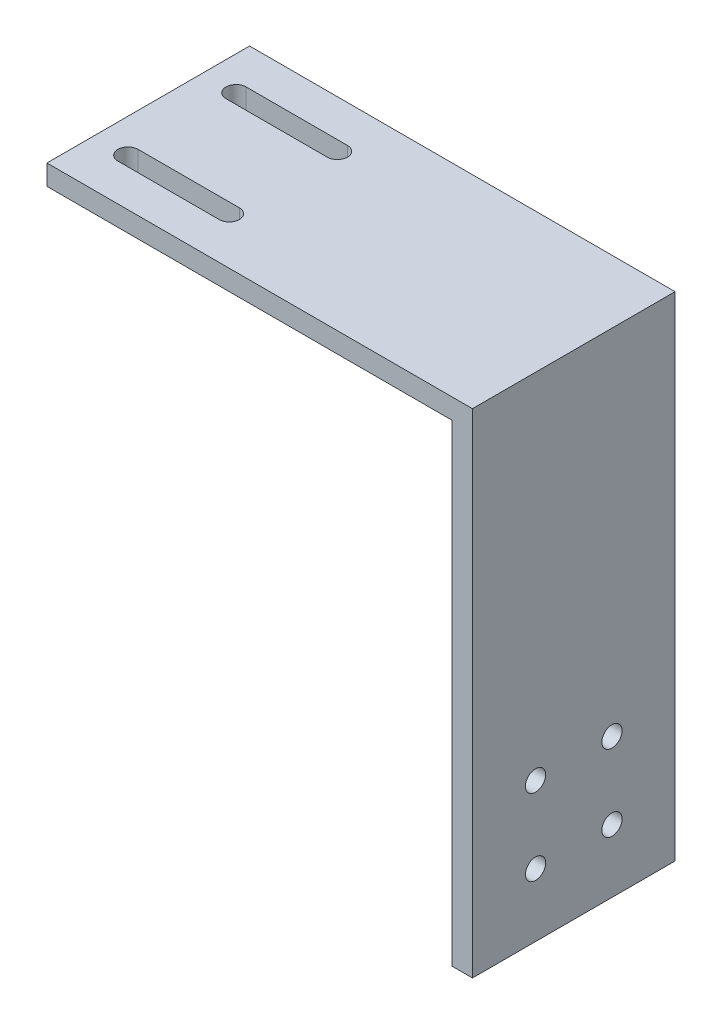
ISO-10303-21;
HEADER;
FILE_DESCRIPTION(('STEP AP214'),'2;1');
FILE_NAME('part.step','',(''),(''),'','','');
FILE_SCHEMA(('AUTOMOTIVE_DESIGN { 1 0 10303 214 1 1 1 1 }'));
ENDSEC;
DATA;
#1=APPLICATION_CONTEXT('core data for automotive mechanical design processes');
#2=APPLICATION_PROTOCOL_DEFINITION('international standard','automotive_design',2000,#1);
#3=PRODUCT_CONTEXT('',#1,'mechanical');
#4=PRODUCT('Part','Part','',(#3));
#5=PRODUCT_RELATED_PRODUCT_CATEGORY('part','',(#4));
#6=PRODUCT_DEFINITION_FORMATION('','',#4);
#7=PRODUCT_DEFINITION_CONTEXT('part definition',#1,'design');
#8=PRODUCT_DEFINITION('design','',#6,#7);
#9=PRODUCT_DEFINITION_SHAPE('','',#8);
#10=(LENGTH_UNIT() NAMED_UNIT(*) SI_UNIT(.MILLI.,.METRE.));
#11=(NAMED_UNIT(*) PLANE_ANGLE_UNIT() SI_UNIT($,.RADIAN.));
#12=(NAMED_UNIT(*) SI_UNIT($,.STERADIAN.) SOLID_ANGLE_UNIT());
#13=UNCERTAINTY_MEASURE_WITH_UNIT(LENGTH_MEASURE(1.E-05),#10,'distance_accuracy_value','');
#14=(GEOMETRIC_REPRESENTATION_CONTEXT(3) GLOBAL_UNCERTAINTY_ASSIGNED_CONTEXT((#13)) GLOBAL_UNIT_ASSIGNED_CONTEXT((#10,
#11,#12)) REPRESENTATION_CONTEXT('',''));
#15=CARTESIAN_POINT('',(0.,0.,0.));
#16=DIRECTION('',(0.,0.,1.));
#17=DIRECTION('',(1.,0.,0.));
#18=AXIS2_PLACEMENT_3D('',#15,#16,#17);
#19=CARTESIAN_POINT('',(-1.92857142857143,65.1357142857143,30.));
#20=DIRECTION('',(0.,-1.,0.));
#21=DIRECTION('',(1.,0.,0.));
#22=AXIS2_PLACEMENT_3D('',#19,#20,#21);
#23=PLANE('',#22);
#24=DIRECTION('',(1.,0.,0.));
#25=VECTOR('',#24,1.);
#26=CARTESIAN_POINT('',(-59.9285714285714,65.1357142857143,8.5));
#27=LINE('',#26,#25);
#28=CARTESIAN_POINT('',(-59.9285714285714,65.1357142857143,8.5));
#29=VERTEX_POINT('',#28);
#30=CARTESIAN_POINT('',(-44.9285714285714,65.1357142857143,8.5));
#31=VERTEX_POINT('',#30);
#32=EDGE_CURVE('E166',#29,#31,#27,.T.);
#33=ORIENTED_EDGE('',*,*,#32,.F.);
#34=CARTESIAN_POINT('',(-59.9285714285714,65.1357142857143,7.));
#35=DIRECTION('',(0.,1.,0.));
#36=DIRECTION('',(1.,0.,0.));
#37=AXIS2_PLACEMENT_3D('',#34,#35,#36);
#38=CIRCLE('',#37,1.5);
#39=CARTESIAN_POINT('',(-59.9285714285714,65.1357142857143,5.5));
#40=VERTEX_POINT('',#39);
#41=EDGE_CURVE('E47',#40,#29,#38,.T.);
#42=ORIENTED_EDGE('',*,*,#41,.F.);
#43=DIRECTION('',(-1.,0.,0.));
#44=VECTOR('',#43,1.);
#45=CARTESIAN_POINT('',(-59.9285714285714,65.1357142857143,5.5));
#46=LINE('',#45,#44);
#47=CARTESIAN_POINT('',(-44.9285714285714,65.1357142857143,5.5));
#48=VERTEX_POINT('',#47);
#49=EDGE_CURVE('E154',#48,#40,#46,.T.);
#50=ORIENTED_EDGE('',*,*,#49,.F.);
#51=CARTESIAN_POINT('',(-44.9285714285714,65.1357142857143,7.));
#52=DIRECTION('',(0.,1.,0.));
#53=DIRECTION('',(-1.,0.,0.));
#54=AXIS2_PLACEMENT_3D('',#51,#52,#53);
#55=CIRCLE('',#54,1.5);
#56=EDGE_CURVE('E157',#31,#48,#55,.T.);
#57=ORIENTED_EDGE('',*,*,#56,.F.);
#58=EDGE_LOOP('',(#33,#42,#50,#57));
#59=FACE_BOUND('',#58,.T.);
#60=DIRECTION('',(1.,0.,0.));
#61=VECTOR('',#60,1.);
#62=CARTESIAN_POINT('',(-59.9285714285714,65.1357142857143,24.5));
#63=LINE('',#62,#61);
#64=CARTESIAN_POINT('',(-59.9285714285714,65.1357142857143,24.5));
#65=VERTEX_POINT('',#64);
#66=CARTESIAN_POINT('',(-44.9285714285714,65.1357142857143,24.5));
#67=VERTEX_POINT('',#66);
#68=EDGE_CURVE('E192',#65,#67,#63,.T.);
#69=ORIENTED_EDGE('',*,*,#68,.F.);
#70=CARTESIAN_POINT('',(-59.9285714285714,65.1357142857143,23.));
#71=DIRECTION('',(0.,1.,0.));
#72=DIRECTION('',(-1.,0.,0.));
#73=AXIS2_PLACEMENT_3D('',#70,#71,#72);
#74=CIRCLE('',#73,1.5);
#75=CARTESIAN_POINT('',(-59.9285714285714,65.1357142857143,21.5));
#76=VERTEX_POINT('',#75);
#77=EDGE_CURVE('E55',#76,#65,#74,.T.);
#78=ORIENTED_EDGE('',*,*,#77,.F.);
#79=DIRECTION('',(-1.,0.,0.));
#80=VECTOR('',#79,1.);
#81=CARTESIAN_POINT('',(-59.9285714285714,65.1357142857143,21.5));
#82=LINE('',#81,#80);
#83=CARTESIAN_POINT('',(-44.9285714285714,65.1357142857143,21.5));
#84=VERTEX_POINT('',#83);
#85=EDGE_CURVE('E181',#84,#76,#82,.T.);
#86=ORIENTED_EDGE('',*,*,#85,.F.);
#87=CARTESIAN_POINT('',(-44.9285714285714,65.1357142857143,23.));
#88=DIRECTION('',(0.,1.,0.));
#89=DIRECTION('',(1.,0.,0.));
#90=AXIS2_PLACEMENT_3D('',#87,#88,#89);
#91=CIRCLE('',#90,1.5);
#92=EDGE_CURVE('E196',#67,#84,#91,.T.);
#93=ORIENTED_EDGE('',*,*,#92,.F.);
#94=EDGE_LOOP('',(#69,#78,#86,#93));
#95=FACE_BOUND('',#94,.T.);
#96=DIRECTION('',(-1.,0.,0.));
#97=VECTOR('',#96,1.);
#98=CARTESIAN_POINT('',(-1.92857142857143,65.1357142857143,0.));
#99=LINE('',#98,#97);
#100=CARTESIAN_POINT('',(-1.92857142857143,65.1357142857143,0.));
#101=VERTEX_POINT('',#100);
#102=CARTESIAN_POINT('',(-64.9285714285714,65.1357142857143,0.));
#103=VERTEX_POINT('',#102);
#104=EDGE_CURVE('E173',#101,#103,#99,.T.);
#105=ORIENTED_EDGE('',*,*,#104,.T.);
#106=DIRECTION('',(0.,0.,-1.));
#107=VECTOR('',#106,1.);
#108=CARTESIAN_POINT('',(-64.9285714285714,65.1357142857143,30.));
#109=LINE('',#108,#107);
#110=CARTESIAN_POINT('',(-64.9285714285714,65.1357142857143,30.));
#111=VERTEX_POINT('',#110);
#112=EDGE_CURVE('E11',#111,#103,#109,.T.);
#113=ORIENTED_EDGE('',*,*,#112,.F.);
#114=DIRECTION('',(-1.,0.,0.));
#115=VECTOR('',#114,1.);
#116=CARTESIAN_POINT('',(-1.92857142857143,65.1357142857143,30.));
#117=LINE('',#116,#115);
#118=CARTESIAN_POINT('',(-1.92857142857143,65.1357142857143,30.));
#119=VERTEX_POINT('',#118);
#120=EDGE_CURVE('E207',#119,#111,#117,.T.);
#121=ORIENTED_EDGE('',*,*,#120,.F.);
#122=DIRECTION('',(0.,0.,-1.));
#123=VECTOR('',#122,1.);
#124=CARTESIAN_POINT('',(-1.92857142857143,65.1357142857143,30.));
#125=LINE('',#124,#123);
#126=EDGE_CURVE('E221',#119,#101,#125,.T.);
#127=ORIENTED_EDGE('',*,*,#126,.T.);
#128=EDGE_LOOP('',(#105,#113,#121,#127));
#129=FACE_BOUND('',#128,.T.);
#130=ADVANCED_FACE('F33',(#59,#95,#129),#23,.F.);
#131=CARTESIAN_POINT('',(-64.9285714285714,65.1357142857143,30.));
#132=DIRECTION('',(1.,0.,0.));
#133=DIRECTION('',(0.,0.,-1.));
#134=AXIS2_PLACEMENT_3D('',#131,#132,#133);
#135=PLANE('',#134);
#136=DIRECTION('',(0.,-1.,0.));
#137=VECTOR('',#136,1.);
#138=CARTESIAN_POINT('',(-64.9285714285714,65.1357142857143,0.));
#139=LINE('',#138,#137);
#140=CARTESIAN_POINT('',(-64.9285714285714,62.1357142857143,0.));
#141=VERTEX_POINT('',#140);
#142=EDGE_CURVE('E224',#103,#141,#139,.T.);
#143=ORIENTED_EDGE('',*,*,#142,.T.);
#144=DIRECTION('',(0.,0.,-1.));
#145=VECTOR('',#144,1.);
#146=CARTESIAN_POINT('',(-64.9285714285714,62.1357142857143,30.));
#147=LINE('',#146,#145);
#148=CARTESIAN_POINT('',(-64.9285714285714,62.1357142857143,30.));
#149=VERTEX_POINT('',#148);
#150=EDGE_CURVE('E40',#149,#141,#147,.T.);
#151=ORIENTED_EDGE('',*,*,#150,.F.);
#152=DIRECTION('',(0.,-1.,0.));
#153=VECTOR('',#152,1.);
#154=CARTESIAN_POINT('',(-64.9285714285714,65.1357142857143,30.));
#155=LINE('',#154,#153);
#156=EDGE_CURVE('E210',#111,#149,#155,.T.);
#157=ORIENTED_EDGE('',*,*,#156,.F.);
#158=ORIENTED_EDGE('',*,*,#112,.T.);
#159=EDGE_LOOP('',(#143,#151,#157,#158));
#160=FACE_BOUND('',#159,.T.);
#161=ADVANCED_FACE('F270',(#160),#135,.F.);
#162=CARTESIAN_POINT('',(-64.9285714285714,62.1357142857143,30.));
#163=DIRECTION('',(0.,1.,0.));
#164=DIRECTION('',(0.,0.,1.));
#165=AXIS2_PLACEMENT_3D('',#162,#163,#164);
#166=PLANE('',#165);
#167=DIRECTION('',(-1.,0.,0.));
#168=VECTOR('',#167,1.);
#169=CARTESIAN_POINT('',(-59.9285714285714,62.1357142857143,5.5));
#170=LINE('',#169,#168);
#171=CARTESIAN_POINT('',(-44.9285714285714,62.1357142857143,5.5));
#172=VERTEX_POINT('',#171);
#173=CARTESIAN_POINT('',(-59.9285714285714,62.1357142857143,5.5));
#174=VERTEX_POINT('',#173);
#175=EDGE_CURVE('E141',#172,#174,#170,.T.);
#176=ORIENTED_EDGE('',*,*,#175,.T.);
#177=CARTESIAN_POINT('',(-59.9285714285714,62.1357142857143,7.));
#178=DIRECTION('',(0.,1.,0.));
#179=DIRECTION('',(1.,0.,0.));
#180=AXIS2_PLACEMENT_3D('',#177,#178,#179);
#181=CIRCLE('',#180,1.5);
#182=CARTESIAN_POINT('',(-59.9285714285714,62.1357142857143,8.5));
#183=VERTEX_POINT('',#182);
#184=EDGE_CURVE('E135',#174,#183,#181,.T.);
#185=ORIENTED_EDGE('',*,*,#184,.T.);
#186=DIRECTION('',(1.,0.,0.));
#187=VECTOR('',#186,1.);
#188=CARTESIAN_POINT('',(-59.9285714285714,62.1357142857143,8.5));
#189=LINE('',#188,#187);
#190=CARTESIAN_POINT('',(-44.9285714285714,62.1357142857143,8.5));
#191=VERTEX_POINT('',#190);
#192=EDGE_CURVE('E145',#183,#191,#189,.T.);
#193=ORIENTED_EDGE('',*,*,#192,.T.);
#194=CARTESIAN_POINT('',(-44.9285714285714,62.1357142857143,7.));
#195=DIRECTION('',(0.,1.,0.));
#196=DIRECTION('',(-1.,0.,0.));
#197=AXIS2_PLACEMENT_3D('',#194,#195,#196);
#198=CIRCLE('',#197,1.5);
#199=EDGE_CURVE('E149',#191,#172,#198,.T.);
#200=ORIENTED_EDGE('',*,*,#199,.T.);
#201=EDGE_LOOP('',(#176,#185,#193,#200));
#202=FACE_BOUND('',#201,.T.);
#203=DIRECTION('',(-1.,0.,0.));
#204=VECTOR('',#203,1.);
#205=CARTESIAN_POINT('',(-59.9285714285714,62.1357142857143,21.5));
#206=LINE('',#205,#204);
#207=CARTESIAN_POINT('',(-44.9285714285714,62.1357142857143,21.5));
#208=VERTEX_POINT('',#207);
#209=CARTESIAN_POINT('',(-59.9285714285714,62.1357142857143,21.5));
#210=VERTEX_POINT('',#209);
#211=EDGE_CURVE('E187',#208,#210,#206,.T.);
#212=ORIENTED_EDGE('',*,*,#211,.T.);
#213=CARTESIAN_POINT('',(-59.9285714285714,62.1357142857143,23.));
#214=DIRECTION('',(0.,1.,0.));
#215=DIRECTION('',(-1.,0.,0.));
#216=AXIS2_PLACEMENT_3D('',#213,#214,#215);
#217=CIRCLE('',#216,1.5);
#218=CARTESIAN_POINT('',(-59.9285714285714,62.1357142857143,24.5));
#219=VERTEX_POINT('',#218);
#220=EDGE_CURVE('E177',#210,#219,#217,.T.);
#221=ORIENTED_EDGE('',*,*,#220,.T.);
#222=DIRECTION('',(1.,0.,0.));
#223=VECTOR('',#222,1.);
#224=CARTESIAN_POINT('',(-59.9285714285714,62.1357142857143,24.5));
#225=LINE('',#224,#223);
#226=CARTESIAN_POINT('',(-44.9285714285714,62.1357142857143,24.5));
#227=VERTEX_POINT('',#226);
#228=EDGE_CURVE('E180',#219,#227,#225,.T.);
#229=ORIENTED_EDGE('',*,*,#228,.T.);
#230=CARTESIAN_POINT('',(-44.9285714285714,62.1357142857143,23.));
#231=DIRECTION('',(0.,1.,0.));
#232=DIRECTION('',(1.,0.,0.));
#233=AXIS2_PLACEMENT_3D('',#230,#231,#232);
#234=CIRCLE('',#233,1.5);
#235=EDGE_CURVE('E184',#227,#208,#234,.T.);
#236=ORIENTED_EDGE('',*,*,#235,.T.);
#237=EDGE_LOOP('',(#212,#221,#229,#236));
#238=FACE_BOUND('',#237,.T.);
#239=DIRECTION('',(1.,0.,0.));
#240=VECTOR('',#239,1.);
#241=CARTESIAN_POINT('',(-64.9285714285714,62.1357142857143,0.));
#242=LINE('',#241,#240);
#243=CARTESIAN_POINT('',(-4.92857142857144,62.1357142857143,0.));
#244=VERTEX_POINT('',#243);
#245=EDGE_CURVE('E226',#141,#244,#242,.T.);
#246=ORIENTED_EDGE('',*,*,#245,.T.);
#247=DIRECTION('',(0.,0.,-1.));
#248=VECTOR('',#247,1.);
#249=CARTESIAN_POINT('',(-4.92857142857144,62.1357142857143,30.));
#250=LINE('',#249,#248);
#251=CARTESIAN_POINT('',(-4.92857142857144,62.1357142857143,30.));
#252=VERTEX_POINT('',#251);
#253=EDGE_CURVE('E241',#252,#244,#250,.T.);
#254=ORIENTED_EDGE('',*,*,#253,.F.);
#255=DIRECTION('',(1.,0.,0.));
#256=VECTOR('',#255,1.);
#257=CARTESIAN_POINT('',(-64.9285714285714,62.1357142857143,30.));
#258=LINE('',#257,#256);
#259=EDGE_CURVE('E213',#149,#252,#258,.T.);
#260=ORIENTED_EDGE('',*,*,#259,.F.);
#261=ORIENTED_EDGE('',*,*,#150,.T.);
#262=EDGE_LOOP('',(#246,#254,#260,#261));
#263=FACE_BOUND('',#262,.T.);
#264=ADVANCED_FACE('F151',(#202,#238,#263),#166,.F.);
#265=CARTESIAN_POINT('',(-4.92857142857144,62.1357142857143,30.));
#266=DIRECTION('',(1.,0.,0.));
#267=DIRECTION('',(0.,1.,0.));
#268=AXIS2_PLACEMENT_3D('',#265,#266,#267);
#269=PLANE('',#268);
#270=CARTESIAN_POINT('',(-4.92857142857143,12.7925685352066,20.6568542494924));
#271=DIRECTION('',(-1.,0.,0.));
#272=DIRECTION('',(0.,-1.,0.));
#273=AXIS2_PLACEMENT_3D('',#270,#271,#272);
#274=CIRCLE('',#273,1.5);
#275=CARTESIAN_POINT('',(-4.92857142857143,11.2925685352066,20.6568542494924));
#276=VERTEX_POINT('',#275);
#277=EDGE_CURVE('E443',#276,#276,#274,.T.);
#278=ORIENTED_EDGE('',*,*,#277,.F.);
#279=EDGE_LOOP('',(#278));
#280=FACE_BOUND('',#279,.T.);
#281=CARTESIAN_POINT('',(-4.92857142857143,12.7925685352067,9.34314575050766));
#282=DIRECTION('',(-1.,0.,0.));
#283=DIRECTION('',(0.,-1.,0.));
#284=AXIS2_PLACEMENT_3D('',#281,#282,#283);
#285=CIRCLE('',#284,1.5);
#286=CARTESIAN_POINT('',(-4.92857142857143,11.2925685352067,9.34314575050766));
#287=VERTEX_POINT('',#286);
#288=EDGE_CURVE('E445',#287,#287,#285,.T.);
#289=ORIENTED_EDGE('',*,*,#288,.F.);
#290=EDGE_LOOP('',(#289));
#291=FACE_BOUND('',#290,.T.);
#292=CARTESIAN_POINT('',(-4.92857142857143,1.47886003622193,9.3431457505076));
#293=DIRECTION('',(-1.,0.,0.));
#294=DIRECTION('',(0.,-1.,0.));
#295=AXIS2_PLACEMENT_3D('',#292,#293,#294);
#296=CIRCLE('',#295,1.5);
#297=CARTESIAN_POINT('',(-4.92857142857143,-0.0211399637780731,9.3431457505076));
#298=VERTEX_POINT('',#297);
#299=EDGE_CURVE('E456',#298,#298,#296,.T.);
#300=ORIENTED_EDGE('',*,*,#299,.F.);
#301=EDGE_LOOP('',(#300));
#302=FACE_BOUND('',#301,.T.);
#303=CARTESIAN_POINT('',(-4.92857142857143,1.47886003622191,20.6568542494924));
#304=DIRECTION('',(-1.,0.,0.));
#305=DIRECTION('',(0.,-1.,0.));
#306=AXIS2_PLACEMENT_3D('',#303,#304,#305);
#307=CIRCLE('',#306,1.5);
#308=CARTESIAN_POINT('',(-4.92857142857143,-0.0211399637780945,20.6568542494924));
#309=VERTEX_POINT('',#308);
#310=EDGE_CURVE('E160',#309,#309,#307,.T.);
#311=ORIENTED_EDGE('',*,*,#310,.F.);
#312=EDGE_LOOP('',(#311));
#313=FACE_BOUND('',#312,.T.);
#314=DIRECTION('',(0.,-1.,0.));
#315=VECTOR('',#314,1.);
#316=CARTESIAN_POINT('',(-4.92857142857144,62.1357142857143,0.));
#317=LINE('',#316,#315);
#318=CARTESIAN_POINT('',(-4.92857142857143,-7.86428571428571,0.));
#319=VERTEX_POINT('',#318);
#320=EDGE_CURVE('E228',#244,#319,#317,.T.);
#321=ORIENTED_EDGE('',*,*,#320,.T.);
#322=DIRECTION('',(0.,0.,-1.));
#323=VECTOR('',#322,1.);
#324=CARTESIAN_POINT('',(-4.92857142857143,-7.86428571428571,30.));
#325=LINE('',#324,#323);
#326=CARTESIAN_POINT('',(-4.92857142857143,-7.86428571428571,30.));
#327=VERTEX_POINT('',#326);
#328=EDGE_CURVE('E238',#327,#319,#325,.T.);
#329=ORIENTED_EDGE('',*,*,#328,.F.);
#330=DIRECTION('',(0.,-1.,0.));
#331=VECTOR('',#330,1.);
#332=CARTESIAN_POINT('',(-4.92857142857144,62.1357142857143,30.));
#333=LINE('',#332,#331);
#334=EDGE_CURVE('E215',#252,#327,#333,.T.);
#335=ORIENTED_EDGE('',*,*,#334,.F.);
#336=ORIENTED_EDGE('',*,*,#253,.T.);
#337=EDGE_LOOP('',(#321,#329,#335,#336));
#338=FACE_BOUND('',#337,.T.);
#339=ADVANCED_FACE('F258',(#280,#291,#302,#313,#338),#269,.F.);
#340=CARTESIAN_POINT('',(-4.92857142857143,-7.86428571428571,30.));
#341=DIRECTION('',(0.,1.,0.));
#342=DIRECTION('',(0.,0.,1.));
#343=AXIS2_PLACEMENT_3D('',#340,#341,#342);
#344=PLANE('',#343);
#345=DIRECTION('',(1.,0.,0.));
#346=VECTOR('',#345,1.);
#347=CARTESIAN_POINT('',(-4.92857142857143,-7.86428571428571,0.));
#348=LINE('',#347,#346);
#349=CARTESIAN_POINT('',(-1.92857142857143,-7.86428571428571,0.));
#350=VERTEX_POINT('',#349);
#351=EDGE_CURVE('E230',#319,#350,#348,.T.);
#352=ORIENTED_EDGE('',*,*,#351,.T.);
#353=DIRECTION('',(0.,0.,-1.));
#354=VECTOR('',#353,1.);
#355=CARTESIAN_POINT('',(-1.92857142857143,-7.86428571428571,30.));
#356=LINE('',#355,#354);
#357=CARTESIAN_POINT('',(-1.92857142857143,-7.86428571428571,30.));
#358=VERTEX_POINT('',#357);
#359=EDGE_CURVE('E235',#358,#350,#356,.T.);
#360=ORIENTED_EDGE('',*,*,#359,.F.);
#361=DIRECTION('',(1.,0.,0.));
#362=VECTOR('',#361,1.);
#363=CARTESIAN_POINT('',(-4.92857142857143,-7.86428571428571,30.));
#364=LINE('',#363,#362);
#365=EDGE_CURVE('E217',#327,#358,#364,.T.);
#366=ORIENTED_EDGE('',*,*,#365,.F.);
#367=ORIENTED_EDGE('',*,*,#328,.T.);
#368=EDGE_LOOP('',(#352,#360,#366,#367));
#369=FACE_BOUND('',#368,.T.);
#370=ADVANCED_FACE('F262',(#369),#344,.F.);
#371=CARTESIAN_POINT('',(-1.92857142857143,-7.86428571428571,30.));
#372=DIRECTION('',(-1.,0.,0.));
#373=DIRECTION('',(0.,-1.,0.));
#374=AXIS2_PLACEMENT_3D('',#371,#372,#373);
#375=PLANE('',#374);
#376=CARTESIAN_POINT('',(-1.92857142857142,12.7925685352066,20.6568542494924));
#377=DIRECTION('',(-1.,0.,0.));
#378=DIRECTION('',(0.,-1.,0.));
#379=AXIS2_PLACEMENT_3D('',#376,#377,#378);
#380=CIRCLE('',#379,1.5);
#381=CARTESIAN_POINT('',(-1.92857142857142,11.2925685352066,20.6568542494924));
#382=VERTEX_POINT('',#381);
#383=EDGE_CURVE('E440',#382,#382,#380,.T.);
#384=ORIENTED_EDGE('',*,*,#383,.T.);
#385=EDGE_LOOP('',(#384));
#386=FACE_BOUND('',#385,.T.);
#387=CARTESIAN_POINT('',(-1.92857142857142,12.7925685352067,9.34314575050766));
#388=DIRECTION('',(-1.,0.,0.));
#389=DIRECTION('',(0.,-1.,0.));
#390=AXIS2_PLACEMENT_3D('',#387,#388,#389);
#391=CIRCLE('',#390,1.5);
#392=CARTESIAN_POINT('',(-1.92857142857142,11.2925685352067,9.34314575050766));
#393=VERTEX_POINT('',#392);
#394=EDGE_CURVE('E461',#393,#393,#391,.T.);
#395=ORIENTED_EDGE('',*,*,#394,.T.);
#396=EDGE_LOOP('',(#395));
#397=FACE_BOUND('',#396,.T.);
#398=CARTESIAN_POINT('',(-1.92857142857142,1.47886003622193,9.3431457505076));
#399=DIRECTION('',(-1.,0.,0.));
#400=DIRECTION('',(0.,-1.,0.));
#401=AXIS2_PLACEMENT_3D('',#398,#399,#400);
#402=CIRCLE('',#401,1.5);
#403=CARTESIAN_POINT('',(-1.92857142857142,-0.0211399637780726,9.3431457505076));
#404=VERTEX_POINT('',#403);
#405=EDGE_CURVE('E452',#404,#404,#402,.T.);
#406=ORIENTED_EDGE('',*,*,#405,.T.);
#407=EDGE_LOOP('',(#406));
#408=FACE_BOUND('',#407,.T.);
#409=CARTESIAN_POINT('',(-1.92857142857142,1.47886003622191,20.6568542494924));
#410=DIRECTION('',(-1.,0.,0.));
#411=DIRECTION('',(0.,-1.,0.));
#412=AXIS2_PLACEMENT_3D('',#409,#410,#411);
#413=CIRCLE('',#412,1.5);
#414=CARTESIAN_POINT('',(-1.92857142857142,-0.0211399637780941,20.6568542494924));
#415=VERTEX_POINT('',#414);
#416=EDGE_CURVE('E193',#415,#415,#413,.T.);
#417=ORIENTED_EDGE('',*,*,#416,.T.);
#418=EDGE_LOOP('',(#417));
#419=FACE_BOUND('',#418,.T.);
#420=DIRECTION('',(0.,1.,0.));
#421=VECTOR('',#420,1.);
#422=CARTESIAN_POINT('',(-1.92857142857143,-7.86428571428571,0.));
#423=LINE('',#422,#421);
#424=EDGE_CURVE('E211',#350,#101,#423,.T.);
#425=ORIENTED_EDGE('',*,*,#424,.T.);
#426=ORIENTED_EDGE('',*,*,#126,.F.);
#427=DIRECTION('',(0.,1.,0.));
#428=VECTOR('',#427,1.);
#429=CARTESIAN_POINT('',(-1.92857142857143,-7.86428571428571,30.));
#430=LINE('',#429,#428);
#431=EDGE_CURVE('E219',#358,#119,#430,.T.);
#432=ORIENTED_EDGE('',*,*,#431,.F.);
#433=ORIENTED_EDGE('',*,*,#359,.T.);
#434=EDGE_LOOP('',(#425,#426,#432,#433));
#435=FACE_BOUND('',#434,.T.);
#436=ADVANCED_FACE('F273',(#386,#397,#408,#419,#435),#375,.F.);
#437=CARTESIAN_POINT('',(0.,0.,30.));
#438=DIRECTION('',(0.,0.,1.));
#439=DIRECTION('',(1.,0.,0.));
#440=AXIS2_PLACEMENT_3D('',#437,#438,#439);
#441=PLANE('',#440);
#442=ORIENTED_EDGE('',*,*,#120,.T.);
#443=ORIENTED_EDGE('',*,*,#156,.T.);
#444=ORIENTED_EDGE('',*,*,#259,.T.);
#445=ORIENTED_EDGE('',*,*,#334,.T.);
#446=ORIENTED_EDGE('',*,*,#365,.T.);
#447=ORIENTED_EDGE('',*,*,#431,.T.);
#448=EDGE_LOOP('',(#442,#443,#444,#445,#446,#447));
#449=FACE_BOUND('',#448,.T.);
#450=ADVANCED_FACE('F266',(#449),#441,.T.);
#451=CARTESIAN_POINT('',(0.,0.,0.));
#452=DIRECTION('',(0.,0.,1.));
#453=DIRECTION('',(1.,0.,0.));
#454=AXIS2_PLACEMENT_3D('',#451,#452,#453);
#455=PLANE('',#454);
#456=ORIENTED_EDGE('',*,*,#104,.F.);
#457=ORIENTED_EDGE('',*,*,#424,.F.);
#458=ORIENTED_EDGE('',*,*,#351,.F.);
#459=ORIENTED_EDGE('',*,*,#320,.F.);
#460=ORIENTED_EDGE('',*,*,#245,.F.);
#461=ORIENTED_EDGE('',*,*,#142,.F.);
#462=EDGE_LOOP('',(#456,#457,#458,#459,#460,#461));
#463=FACE_BOUND('',#462,.T.);
#464=ADVANCED_FACE('F253',(#463),#455,.F.);
#465=CARTESIAN_POINT('',(-59.9285714285714,62.1357142857143,23.));
#466=DIRECTION('',(0.,1.,0.));
#467=DIRECTION('',(-1.,0.,0.));
#468=AXIS2_PLACEMENT_3D('',#465,#466,#467);
#469=CYLINDRICAL_SURFACE('',#468,1.5);
#470=ORIENTED_EDGE('',*,*,#77,.T.);
#471=DIRECTION('',(0.,1.,0.));
#472=VECTOR('',#471,1.);
#473=CARTESIAN_POINT('',(-59.9285714285714,62.1357142857143,24.5));
#474=LINE('',#473,#472);
#475=EDGE_CURVE('E190',#219,#65,#474,.T.);
#476=ORIENTED_EDGE('',*,*,#475,.F.);
#477=ORIENTED_EDGE('',*,*,#220,.F.);
#478=DIRECTION('',(0.,1.,0.));
#479=VECTOR('',#478,1.);
#480=CARTESIAN_POINT('',(-59.9285714285714,62.1357142857143,21.5));
#481=LINE('',#480,#479);
#482=EDGE_CURVE('E167',#210,#76,#481,.T.);
#483=ORIENTED_EDGE('',*,*,#482,.T.);
#484=EDGE_LOOP('',(#470,#476,#477,#483));
#485=FACE_BOUND('',#484,.T.);
#486=ADVANCED_FACE('F301',(#485),#469,.F.);
#487=CARTESIAN_POINT('',(-59.9285714285714,62.1357142857143,21.5));
#488=DIRECTION('',(0.,0.,-1.));
#489=DIRECTION('',(-1.,0.,0.));
#490=AXIS2_PLACEMENT_3D('',#487,#488,#489);
#491=PLANE('',#490);
#492=ORIENTED_EDGE('',*,*,#85,.T.);
#493=ORIENTED_EDGE('',*,*,#482,.F.);
#494=ORIENTED_EDGE('',*,*,#211,.F.);
#495=DIRECTION('',(0.,1.,0.));
#496=VECTOR('',#495,1.);
#497=CARTESIAN_POINT('',(-44.9285714285714,62.1357142857143,21.5));
#498=LINE('',#497,#496);
#499=EDGE_CURVE('E202',#208,#84,#498,.T.);
#500=ORIENTED_EDGE('',*,*,#499,.T.);
#501=EDGE_LOOP('',(#492,#493,#494,#500));
#502=FACE_BOUND('',#501,.T.);
#503=ADVANCED_FACE('F304',(#502),#491,.F.);
#504=CARTESIAN_POINT('',(-44.9285714285714,62.1357142857143,23.));
#505=DIRECTION('',(0.,1.,0.));
#506=DIRECTION('',(-1.,0.,0.));
#507=AXIS2_PLACEMENT_3D('',#504,#505,#506);
#508=CYLINDRICAL_SURFACE('',#507,1.5);
#509=ORIENTED_EDGE('',*,*,#92,.T.);
#510=ORIENTED_EDGE('',*,*,#499,.F.);
#511=ORIENTED_EDGE('',*,*,#235,.F.);
#512=DIRECTION('',(0.,1.,0.));
#513=VECTOR('',#512,1.);
#514=CARTESIAN_POINT('',(-44.9285714285714,62.1357142857143,24.5));
#515=LINE('',#514,#513);
#516=EDGE_CURVE('E204',#227,#67,#515,.T.);
#517=ORIENTED_EDGE('',*,*,#516,.T.);
#518=EDGE_LOOP('',(#509,#510,#511,#517));
#519=FACE_BOUND('',#518,.T.);
#520=ADVANCED_FACE('F306',(#519),#508,.F.);
#521=CARTESIAN_POINT('',(-59.9285714285714,62.1357142857143,24.5));
#522=DIRECTION('',(0.,0.,1.));
#523=DIRECTION('',(1.,0.,0.));
#524=AXIS2_PLACEMENT_3D('',#521,#522,#523);
#525=PLANE('',#524);
#526=ORIENTED_EDGE('',*,*,#68,.T.);
#527=ORIENTED_EDGE('',*,*,#516,.F.);
#528=ORIENTED_EDGE('',*,*,#228,.F.);
#529=ORIENTED_EDGE('',*,*,#475,.T.);
#530=EDGE_LOOP('',(#526,#527,#528,#529));
#531=FACE_BOUND('',#530,.T.);
#532=ADVANCED_FACE('F298',(#531),#525,.F.);
#533=CARTESIAN_POINT('',(-59.9285714285714,62.1357142857143,7.));
#534=DIRECTION('',(0.,1.,0.));
#535=DIRECTION('',(-1.,0.,0.));
#536=AXIS2_PLACEMENT_3D('',#533,#534,#535);
#537=CYLINDRICAL_SURFACE('',#536,1.5);
#538=ORIENTED_EDGE('',*,*,#41,.T.);
#539=DIRECTION('',(0.,1.,0.));
#540=VECTOR('',#539,1.);
#541=CARTESIAN_POINT('',(-59.9285714285714,62.1357142857143,8.5));
#542=LINE('',#541,#540);
#543=EDGE_CURVE('E131',#183,#29,#542,.T.);
#544=ORIENTED_EDGE('',*,*,#543,.F.);
#545=ORIENTED_EDGE('',*,*,#184,.F.);
#546=DIRECTION('',(0.,1.,0.));
#547=VECTOR('',#546,1.);
#548=CARTESIAN_POINT('',(-59.9285714285714,62.1357142857143,5.5));
#549=LINE('',#548,#547);
#550=EDGE_CURVE('E171',#174,#40,#549,.T.);
#551=ORIENTED_EDGE('',*,*,#550,.T.);
#552=EDGE_LOOP('',(#538,#544,#545,#551));
#553=FACE_BOUND('',#552,.T.);
#554=ADVANCED_FACE('F133',(#553),#537,.F.);
#555=CARTESIAN_POINT('',(-59.9285714285714,62.1357142857143,5.5));
#556=DIRECTION('',(0.,0.,-1.));
#557=DIRECTION('',(-1.,0.,0.));
#558=AXIS2_PLACEMENT_3D('',#555,#556,#557);
#559=PLANE('',#558);
#560=ORIENTED_EDGE('',*,*,#49,.T.);
#561=ORIENTED_EDGE('',*,*,#550,.F.);
#562=ORIENTED_EDGE('',*,*,#175,.F.);
#563=DIRECTION('',(0.,1.,0.));
#564=VECTOR('',#563,1.);
#565=CARTESIAN_POINT('',(-44.9285714285714,62.1357142857143,5.5));
#566=LINE('',#565,#564);
#567=EDGE_CURVE('E174',#172,#48,#566,.T.);
#568=ORIENTED_EDGE('',*,*,#567,.T.);
#569=EDGE_LOOP('',(#560,#561,#562,#568));
#570=FACE_BOUND('',#569,.T.);
#571=ADVANCED_FACE('F351',(#570),#559,.F.);
#572=CARTESIAN_POINT('',(-44.9285714285714,62.1357142857143,7.));
#573=DIRECTION('',(0.,1.,0.));
#574=DIRECTION('',(-1.,0.,0.));
#575=AXIS2_PLACEMENT_3D('',#572,#573,#574);
#576=CYLINDRICAL_SURFACE('',#575,1.5);
#577=ORIENTED_EDGE('',*,*,#56,.T.);
#578=ORIENTED_EDGE('',*,*,#567,.F.);
#579=ORIENTED_EDGE('',*,*,#199,.F.);
#580=DIRECTION('',(0.,1.,0.));
#581=VECTOR('',#580,1.);
#582=CARTESIAN_POINT('',(-44.9285714285714,62.1357142857143,8.5));
#583=LINE('',#582,#581);
#584=EDGE_CURVE('E140',#191,#31,#583,.T.);
#585=ORIENTED_EDGE('',*,*,#584,.T.);
#586=EDGE_LOOP('',(#577,#578,#579,#585));
#587=FACE_BOUND('',#586,.T.);
#588=ADVANCED_FACE('F359',(#587),#576,.F.);
#589=CARTESIAN_POINT('',(-59.9285714285714,62.1357142857143,8.5));
#590=DIRECTION('',(0.,0.,1.));
#591=DIRECTION('',(1.,0.,0.));
#592=AXIS2_PLACEMENT_3D('',#589,#590,#591);
#593=PLANE('',#592);
#594=ORIENTED_EDGE('',*,*,#32,.T.);
#595=ORIENTED_EDGE('',*,*,#584,.F.);
#596=ORIENTED_EDGE('',*,*,#192,.F.);
#597=ORIENTED_EDGE('',*,*,#543,.T.);
#598=EDGE_LOOP('',(#594,#595,#596,#597));
#599=FACE_BOUND('',#598,.T.);
#600=ADVANCED_FACE('F146',(#599),#593,.F.);
#601=CARTESIAN_POINT('',(-1.92857142857142,1.47886003622191,20.6568542494924));
#602=DIRECTION('',(-1.,0.,0.));
#603=DIRECTION('',(0.,-1.,0.));
#604=AXIS2_PLACEMENT_3D('',#601,#602,#603);
#605=CYLINDRICAL_SURFACE('',#604,1.5);
#606=ORIENTED_EDGE('',*,*,#416,.F.);
#607=EDGE_LOOP('',(#606));
#608=FACE_BOUND('',#607,.T.);
#609=ORIENTED_EDGE('',*,*,#310,.T.);
#610=EDGE_LOOP('',(#609));
#611=FACE_BOUND('',#610,.T.);
#612=ADVANCED_FACE('F378',(#608,#611),#605,.F.);
#613=CARTESIAN_POINT('',(-1.92857142857142,1.47886003622193,9.3431457505076));
#614=DIRECTION('',(-1.,0.,0.));
#615=DIRECTION('',(0.,-1.,0.));
#616=AXIS2_PLACEMENT_3D('',#613,#614,#615);
#617=CYLINDRICAL_SURFACE('',#616,1.5);
#618=ORIENTED_EDGE('',*,*,#405,.F.);
#619=EDGE_LOOP('',(#618));
#620=FACE_BOUND('',#619,.T.);
#621=ORIENTED_EDGE('',*,*,#299,.T.);
#622=EDGE_LOOP('',(#621));
#623=FACE_BOUND('',#622,.T.);
#624=ADVANCED_FACE('F404',(#620,#623),#617,.F.);
#625=CARTESIAN_POINT('',(-1.92857142857142,12.7925685352067,9.34314575050766));
#626=DIRECTION('',(-1.,0.,0.));
#627=DIRECTION('',(0.,-1.,0.));
#628=AXIS2_PLACEMENT_3D('',#625,#626,#627);
#629=CYLINDRICAL_SURFACE('',#628,1.5);
#630=ORIENTED_EDGE('',*,*,#394,.F.);
#631=EDGE_LOOP('',(#630));
#632=FACE_BOUND('',#631,.T.);
#633=ORIENTED_EDGE('',*,*,#288,.T.);
#634=EDGE_LOOP('',(#633));
#635=FACE_BOUND('',#634,.T.);
#636=ADVANCED_FACE('F414',(#632,#635),#629,.F.);
#637=CARTESIAN_POINT('',(-1.92857142857142,12.7925685352066,20.6568542494924));
#638=DIRECTION('',(-1.,0.,0.));
#639=DIRECTION('',(0.,-1.,0.));
#640=AXIS2_PLACEMENT_3D('',#637,#638,#639);
#641=CYLINDRICAL_SURFACE('',#640,1.5);
#642=ORIENTED_EDGE('',*,*,#383,.F.);
#643=EDGE_LOOP('',(#642));
#644=FACE_BOUND('',#643,.T.);
#645=ORIENTED_EDGE('',*,*,#277,.T.);
#646=EDGE_LOOP('',(#645));
#647=FACE_BOUND('',#646,.T.);
#648=ADVANCED_FACE('F424',(#644,#647),#641,.F.);
#649=CLOSED_SHELL('',(#130,#161,#264,#339,#370,#436,#450,#464,#486,#503,#520,#532,#554,#571,
#588,#600,#612,#624,#636,#648));
#650=MANIFOLD_SOLID_BREP('B2',#649);
#651=ADVANCED_BREP_SHAPE_REPRESENTATION('',(#18,#650),#14);
#652=SHAPE_DEFINITION_REPRESENTATION(#9,#651);
ENDSEC;
END-ISO-10303-21;
